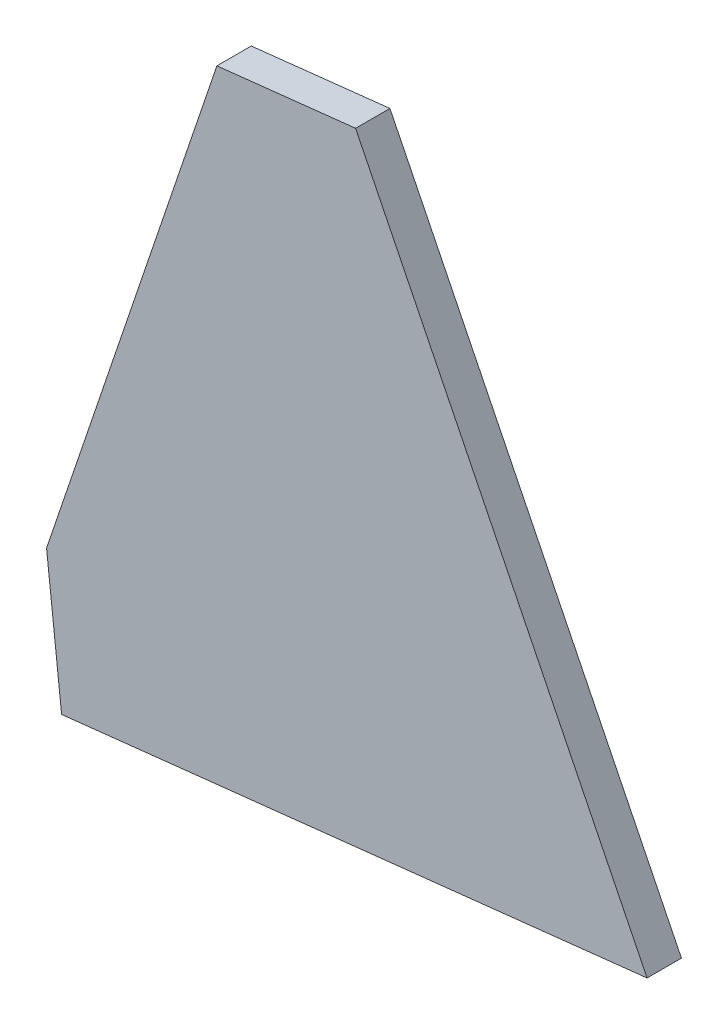
ISO-10303-21;
HEADER;
FILE_DESCRIPTION(('STEP AP214'),'2;1');
FILE_NAME('part.step','',(''),(''),'','','');
FILE_SCHEMA(('AUTOMOTIVE_DESIGN { 1 0 10303 214 1 1 1 1 }'));
ENDSEC;
DATA;
#1=APPLICATION_CONTEXT('core data for automotive mechanical design processes');
#2=APPLICATION_PROTOCOL_DEFINITION('international standard','automotive_design',2000,#1);
#3=PRODUCT_CONTEXT('',#1,'mechanical');
#4=PRODUCT('Part','Part','',(#3));
#5=PRODUCT_RELATED_PRODUCT_CATEGORY('part','',(#4));
#6=PRODUCT_DEFINITION_FORMATION('','',#4);
#7=PRODUCT_DEFINITION_CONTEXT('part definition',#1,'design');
#8=PRODUCT_DEFINITION('design','',#6,#7);
#9=PRODUCT_DEFINITION_SHAPE('','',#8);
#10=(LENGTH_UNIT() NAMED_UNIT(*) SI_UNIT(.MILLI.,.METRE.));
#11=(NAMED_UNIT(*) PLANE_ANGLE_UNIT() SI_UNIT($,.RADIAN.));
#12=(NAMED_UNIT(*) SI_UNIT($,.STERADIAN.) SOLID_ANGLE_UNIT());
#13=UNCERTAINTY_MEASURE_WITH_UNIT(LENGTH_MEASURE(1.E-05),#10,'distance_accuracy_value','');
#14=(GEOMETRIC_REPRESENTATION_CONTEXT(3) GLOBAL_UNCERTAINTY_ASSIGNED_CONTEXT((#13)) GLOBAL_UNIT_ASSIGNED_CONTEXT((#10,
#11,#12)) REPRESENTATION_CONTEXT('',''));
#15=CARTESIAN_POINT('',(0.,0.,0.));
#16=DIRECTION('',(0.,0.,1.));
#17=DIRECTION('',(1.,0.,0.));
#18=AXIS2_PLACEMENT_3D('',#15,#16,#17);
#19=CARTESIAN_POINT('',(-70.8622586411559,-129.488276674194,10.));
#20=DIRECTION('',(0.993984331393458,0.109522367324217,0.));
#21=DIRECTION('',(-0.109522367324217,0.993984331393458,0.));
#22=AXIS2_PLACEMENT_3D('',#19,#20,#21);
#23=PLANE('',#22);
#24=DIRECTION('',(0.109522367324217,-0.993984331393458,0.));
#25=VECTOR('',#24,1.);
#26=CARTESIAN_POINT('',(-70.8622586411559,-129.488276674194,0.));
#27=LINE('',#26,#25);
#28=CARTESIAN_POINT('',(-70.8622586411559,-129.488276674194,0.));
#29=VERTEX_POINT('',#28);
#30=CARTESIAN_POINT('',(-66.4813639481872,-169.247649929933,0.));
#31=VERTEX_POINT('',#30);
#32=EDGE_CURVE('E107',#29,#31,#27,.T.);
#33=ORIENTED_EDGE('',*,*,#32,.T.);
#34=DIRECTION('',(0.,0.,-1.));
#35=VECTOR('',#34,1.);
#36=CARTESIAN_POINT('',(-66.4813639481872,-169.247649929933,10.));
#37=LINE('',#36,#35);
#38=CARTESIAN_POINT('',(-66.4813639481872,-169.247649929933,10.));
#39=VERTEX_POINT('',#38);
#40=EDGE_CURVE('E11',#39,#31,#37,.T.);
#41=ORIENTED_EDGE('',*,*,#40,.F.);
#42=DIRECTION('',(0.109522367324217,-0.993984331393458,0.));
#43=VECTOR('',#42,1.);
#44=CARTESIAN_POINT('',(-70.8622586411559,-129.488276674194,10.));
#45=LINE('',#44,#43);
#46=CARTESIAN_POINT('',(-70.8622586411559,-129.488276674194,10.));
#47=VERTEX_POINT('',#46);
#48=EDGE_CURVE('E115',#47,#39,#45,.T.);
#49=ORIENTED_EDGE('',*,*,#48,.F.);
#50=DIRECTION('',(0.,0.,-1.));
#51=VECTOR('',#50,1.);
#52=CARTESIAN_POINT('',(-70.8622586411559,-129.488276674194,10.));
#53=LINE('',#52,#51);
#54=EDGE_CURVE('E103',#47,#29,#53,.T.);
#55=ORIENTED_EDGE('',*,*,#54,.T.);
#56=EDGE_LOOP('',(#33,#41,#49,#55));
#57=FACE_BOUND('',#56,.T.);
#58=ADVANCED_FACE('F33',(#57),#23,.F.);
#59=CARTESIAN_POINT('',(-66.4813639481872,-169.247649929933,10.));
#60=DIRECTION('',(-0.109522367324217,0.993984331393458,0.));
#61=DIRECTION('',(-0.993984331393458,-0.109522367324217,0.));
#62=AXIS2_PLACEMENT_3D('',#59,#60,#61);
#63=PLANE('',#62);
#64=DIRECTION('',(0.993984331393458,0.109522367324217,0.));
#65=VECTOR('',#64,1.);
#66=CARTESIAN_POINT('',(-66.4813639481872,-169.247649929933,0.));
#67=LINE('',#66,#65);
#68=CARTESIAN_POINT('',(103.944522312857,-150.469238714466,0.));
#69=VERTEX_POINT('',#68);
#70=EDGE_CURVE('E110',#31,#69,#67,.T.);
#71=ORIENTED_EDGE('',*,*,#70,.T.);
#72=DIRECTION('',(0.,0.,-1.));
#73=VECTOR('',#72,1.);
#74=CARTESIAN_POINT('',(103.944522312857,-150.469238714466,10.));
#75=LINE('',#74,#73);
#76=CARTESIAN_POINT('',(103.944522312857,-150.469238714466,10.));
#77=VERTEX_POINT('',#76);
#78=EDGE_CURVE('E41',#77,#69,#75,.T.);
#79=ORIENTED_EDGE('',*,*,#78,.F.);
#80=DIRECTION('',(0.993984331393458,0.109522367324217,0.));
#81=VECTOR('',#80,1.);
#82=CARTESIAN_POINT('',(-66.4813639481872,-169.247649929933,10.));
#83=LINE('',#82,#81);
#84=EDGE_CURVE('E83',#39,#77,#83,.T.);
#85=ORIENTED_EDGE('',*,*,#84,.F.);
#86=ORIENTED_EDGE('',*,*,#40,.T.);
#87=EDGE_LOOP('',(#71,#79,#85,#86));
#88=FACE_BOUND('',#87,.T.);
#89=ADVANCED_FACE('F134',(#88),#63,.F.);
#90=CARTESIAN_POINT('',(103.944522312857,-150.469238714466,10.));
#91=DIRECTION('',(-0.896580885617655,-0.442880023872224,0.));
#92=DIRECTION('',(0.442880023872224,-0.896580885617655,0.));
#93=AXIS2_PLACEMENT_3D('',#90,#91,#92);
#94=PLANE('',#93);
#95=DIRECTION('',(-0.442880023872224,0.896580885617655,0.));
#96=VECTOR('',#95,1.);
#97=CARTESIAN_POINT('',(103.944522312857,-150.469238714466,0.));
#98=LINE('',#97,#96);
#99=CARTESIAN_POINT('',(19.0901075902019,21.3128291138083,0.));
#100=VERTEX_POINT('',#99);
#101=EDGE_CURVE('E98',#69,#100,#98,.T.);
#102=ORIENTED_EDGE('',*,*,#101,.T.);
#103=DIRECTION('',(0.,0.,-1.));
#104=VECTOR('',#103,1.);
#105=CARTESIAN_POINT('',(19.0901075902019,21.3128291138083,10.));
#106=LINE('',#105,#104);
#107=CARTESIAN_POINT('',(19.0901075902019,21.3128291138083,10.));
#108=VERTEX_POINT('',#107);
#109=EDGE_CURVE('E95',#108,#100,#106,.T.);
#110=ORIENTED_EDGE('',*,*,#109,.F.);
#111=DIRECTION('',(-0.442880023872224,0.896580885617655,0.));
#112=VECTOR('',#111,1.);
#113=CARTESIAN_POINT('',(103.944522312857,-150.469238714466,10.));
#114=LINE('',#113,#112);
#115=EDGE_CURVE('E87',#77,#108,#114,.T.);
#116=ORIENTED_EDGE('',*,*,#115,.F.);
#117=ORIENTED_EDGE('',*,*,#78,.T.);
#118=EDGE_LOOP('',(#102,#110,#116,#117));
#119=FACE_BOUND('',#118,.T.);
#120=ADVANCED_FACE('F96',(#119),#94,.F.);
#121=CARTESIAN_POINT('',(19.0901075902019,21.3128291138083,10.));
#122=DIRECTION('',(0.109522367324218,-0.993984331393458,0.));
#123=DIRECTION('',(0.993984331393458,0.109522367324218,0.));
#124=AXIS2_PLACEMENT_3D('',#121,#122,#123);
#125=PLANE('',#124);
#126=DIRECTION('',(-0.993984331393458,-0.109522367324218,0.));
#127=VECTOR('',#126,1.);
#128=CARTESIAN_POINT('',(19.0901075902019,21.3128291138083,0.));
#129=LINE('',#128,#127);
#130=CARTESIAN_POINT('',(-21.2826180855731,16.8643520586988,0.));
#131=VERTEX_POINT('',#130);
#132=EDGE_CURVE('E69',#100,#131,#129,.T.);
#133=ORIENTED_EDGE('',*,*,#132,.T.);
#134=DIRECTION('',(0.,0.,-1.));
#135=VECTOR('',#134,1.);
#136=CARTESIAN_POINT('',(-21.2826180855731,16.8643520586988,10.));
#137=LINE('',#136,#135);
#138=CARTESIAN_POINT('',(-21.2826180855731,16.8643520586988,10.));
#139=VERTEX_POINT('',#138);
#140=EDGE_CURVE('E99',#139,#131,#137,.T.);
#141=ORIENTED_EDGE('',*,*,#140,.F.);
#142=DIRECTION('',(-0.993984331393458,-0.109522367324218,0.));
#143=VECTOR('',#142,1.);
#144=CARTESIAN_POINT('',(19.0901075902019,21.3128291138083,10.));
#145=LINE('',#144,#143);
#146=EDGE_CURVE('E91',#108,#139,#145,.T.);
#147=ORIENTED_EDGE('',*,*,#146,.F.);
#148=ORIENTED_EDGE('',*,*,#109,.T.);
#149=EDGE_LOOP('',(#133,#141,#147,#148));
#150=FACE_BOUND('',#149,.T.);
#151=ADVANCED_FACE('F101',(#150),#125,.F.);
#152=CARTESIAN_POINT('',(-21.2826180855731,16.8643520586988,10.));
#153=DIRECTION('',(0.947127685269965,-0.320856896131528,0.));
#154=DIRECTION('',(0.320856896131528,0.947127685269965,0.));
#155=AXIS2_PLACEMENT_3D('',#152,#153,#154);
#156=PLANE('',#155);
#157=DIRECTION('',(-0.320856896131528,-0.947127685269965,0.));
#158=VECTOR('',#157,1.);
#159=CARTESIAN_POINT('',(-21.2826180855731,16.8643520586988,0.));
#160=LINE('',#159,#158);
#161=EDGE_CURVE('E75',#131,#29,#160,.T.);
#162=ORIENTED_EDGE('',*,*,#161,.T.);
#163=ORIENTED_EDGE('',*,*,#54,.F.);
#164=DIRECTION('',(-0.320856896131528,-0.947127685269965,0.));
#165=VECTOR('',#164,1.);
#166=CARTESIAN_POINT('',(-21.2826180855731,16.8643520586988,10.));
#167=LINE('',#166,#165);
#168=EDGE_CURVE('E49',#139,#47,#167,.T.);
#169=ORIENTED_EDGE('',*,*,#168,.F.);
#170=ORIENTED_EDGE('',*,*,#140,.T.);
#171=EDGE_LOOP('',(#162,#163,#169,#170));
#172=FACE_BOUND('',#171,.T.);
#173=ADVANCED_FACE('F123',(#172),#156,.F.);
#174=CARTESIAN_POINT('',(0.,0.,10.));
#175=DIRECTION('',(0.,0.,1.));
#176=DIRECTION('',(1.,0.,0.));
#177=AXIS2_PLACEMENT_3D('',#174,#175,#176);
#178=PLANE('',#177);
#179=ORIENTED_EDGE('',*,*,#48,.T.);
#180=ORIENTED_EDGE('',*,*,#84,.T.);
#181=ORIENTED_EDGE('',*,*,#115,.T.);
#182=ORIENTED_EDGE('',*,*,#146,.T.);
#183=ORIENTED_EDGE('',*,*,#168,.T.);
#184=EDGE_LOOP('',(#179,#180,#181,#182,#183));
#185=FACE_BOUND('',#184,.T.);
#186=ADVANCED_FACE('F89',(#185),#178,.T.);
#187=CARTESIAN_POINT('',(0.,0.,0.));
#188=DIRECTION('',(0.,0.,1.));
#189=DIRECTION('',(1.,0.,0.));
#190=AXIS2_PLACEMENT_3D('',#187,#188,#189);
#191=PLANE('',#190);
#192=ORIENTED_EDGE('',*,*,#32,.F.);
#193=ORIENTED_EDGE('',*,*,#161,.F.);
#194=ORIENTED_EDGE('',*,*,#132,.F.);
#195=ORIENTED_EDGE('',*,*,#101,.F.);
#196=ORIENTED_EDGE('',*,*,#70,.F.);
#197=EDGE_LOOP('',(#192,#193,#194,#195,#196));
#198=FACE_BOUND('',#197,.T.);
#199=ADVANCED_FACE('F119',(#198),#191,.F.);
#200=CLOSED_SHELL('',(#58,#89,#120,#151,#173,#186,#199));
#201=MANIFOLD_SOLID_BREP('B2',#200);
#202=ADVANCED_BREP_SHAPE_REPRESENTATION('',(#18,#201),#14);
#203=SHAPE_DEFINITION_REPRESENTATION(#9,#202);
ENDSEC;
END-ISO-10303-21;
